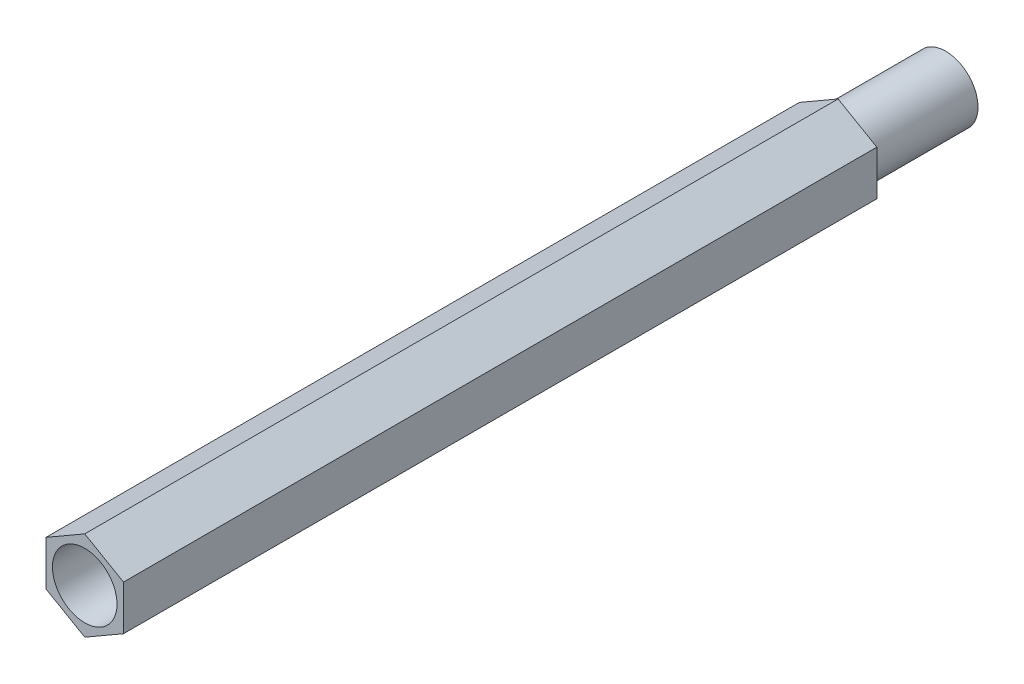
ISO-10303-21;
HEADER;
FILE_DESCRIPTION(('STEP AP214'),'2;1');
FILE_NAME('part.step','',(''),(''),'','','');
FILE_SCHEMA(('AUTOMOTIVE_DESIGN { 1 0 10303 214 1 1 1 1 }'));
ENDSEC;
DATA;
#1=APPLICATION_CONTEXT('core data for automotive mechanical design processes');
#2=APPLICATION_PROTOCOL_DEFINITION('international standard','automotive_design',2000,#1);
#3=PRODUCT_CONTEXT('',#1,'mechanical');
#4=PRODUCT('Part','Part','',(#3));
#5=PRODUCT_RELATED_PRODUCT_CATEGORY('part','',(#4));
#6=PRODUCT_DEFINITION_FORMATION('','',#4);
#7=PRODUCT_DEFINITION_CONTEXT('part definition',#1,'design');
#8=PRODUCT_DEFINITION('design','',#6,#7);
#9=PRODUCT_DEFINITION_SHAPE('','',#8);
#10=(LENGTH_UNIT() NAMED_UNIT(*) SI_UNIT(.MILLI.,.METRE.));
#11=(NAMED_UNIT(*) PLANE_ANGLE_UNIT() SI_UNIT($,.RADIAN.));
#12=(NAMED_UNIT(*) SI_UNIT($,.STERADIAN.) SOLID_ANGLE_UNIT());
#13=UNCERTAINTY_MEASURE_WITH_UNIT(LENGTH_MEASURE(1.E-05),#10,'distance_accuracy_value','');
#14=(GEOMETRIC_REPRESENTATION_CONTEXT(3) GLOBAL_UNCERTAINTY_ASSIGNED_CONTEXT((#13)) GLOBAL_UNIT_ASSIGNED_CONTEXT((#10,
#11,#12)) REPRESENTATION_CONTEXT('',''));
#15=CARTESIAN_POINT('',(0.,0.,0.));
#16=DIRECTION('',(0.,0.,1.));
#17=DIRECTION('',(1.,0.,0.));
#18=AXIS2_PLACEMENT_3D('',#15,#16,#17);
#19=CARTESIAN_POINT('',(0.,0.,35.));
#20=DIRECTION('',(0.,0.,-1.));
#21=DIRECTION('',(-1.,0.,0.));
#22=AXIS2_PLACEMENT_3D('',#19,#20,#21);
#23=CYLINDRICAL_SURFACE('',#22,1.5);
#24=CARTESIAN_POINT('',(0.,0.,35.));
#25=DIRECTION('',(0.,0.,1.));
#26=DIRECTION('',(1.,0.,0.));
#27=AXIS2_PLACEMENT_3D('',#24,#25,#26);
#28=CIRCLE('',#27,1.5);
#29=CARTESIAN_POINT('',(1.5,0.,35.));
#30=VERTEX_POINT('',#29);
#31=EDGE_CURVE('E141',#30,#30,#28,.T.);
#32=ORIENTED_EDGE('',*,*,#31,.T.);
#33=EDGE_LOOP('',(#32));
#34=FACE_BOUND('',#33,.T.);
#35=CARTESIAN_POINT('',(0.,0.,5.));
#36=DIRECTION('',(0.,0.,-1.));
#37=DIRECTION('',(-1.,0.,0.));
#38=AXIS2_PLACEMENT_3D('',#35,#36,#37);
#39=CIRCLE('',#38,1.5);
#40=CARTESIAN_POINT('',(-1.5,0.,5.));
#41=VERTEX_POINT('',#40);
#42=EDGE_CURVE('E258',#41,#41,#39,.T.);
#43=ORIENTED_EDGE('',*,*,#42,.T.);
#44=EDGE_LOOP('',(#43));
#45=FACE_BOUND('',#44,.T.);
#46=ADVANCED_FACE('F45',(#34,#45),#23,.F.);
#47=CARTESIAN_POINT('',(0.,0.,35.));
#48=DIRECTION('',(0.,0.,1.));
#49=DIRECTION('',(1.,0.,0.));
#50=AXIS2_PLACEMENT_3D('',#47,#48,#49);
#51=PLANE('',#50);
#52=DIRECTION('',(-0.866025403784439,0.5,0.));
#53=VECTOR('',#52,1.);
#54=CARTESIAN_POINT('',(1.8,1.03923048454133,35.));
#55=LINE('',#54,#53);
#56=CARTESIAN_POINT('',(1.8,1.03923048454133,35.));
#57=VERTEX_POINT('',#56);
#58=CARTESIAN_POINT('',(0.,2.07846096908265,35.));
#59=VERTEX_POINT('',#58);
#60=EDGE_CURVE('E153',#57,#59,#55,.T.);
#61=ORIENTED_EDGE('',*,*,#60,.T.);
#62=DIRECTION('',(-0.866025403784439,-0.5,0.));
#63=VECTOR('',#62,1.);
#64=CARTESIAN_POINT('',(0.,2.07846096908265,35.));
#65=LINE('',#64,#63);
#66=CARTESIAN_POINT('',(-1.8,1.03923048454133,35.));
#67=VERTEX_POINT('',#66);
#68=EDGE_CURVE('E100',#59,#67,#65,.T.);
#69=ORIENTED_EDGE('',*,*,#68,.T.);
#70=DIRECTION('',(0.,-1.,0.));
#71=VECTOR('',#70,1.);
#72=CARTESIAN_POINT('',(-1.8,1.03923048454133,35.));
#73=LINE('',#72,#71);
#74=CARTESIAN_POINT('',(-1.8,-1.03923048454133,35.));
#75=VERTEX_POINT('',#74);
#76=EDGE_CURVE('E114',#67,#75,#73,.T.);
#77=ORIENTED_EDGE('',*,*,#76,.T.);
#78=DIRECTION('',(0.866025403784439,-0.5,0.));
#79=VECTOR('',#78,1.);
#80=CARTESIAN_POINT('',(-1.8,-1.03923048454133,35.));
#81=LINE('',#80,#79);
#82=CARTESIAN_POINT('',(0.,-2.07846096908265,35.));
#83=VERTEX_POINT('',#82);
#84=EDGE_CURVE('E107',#75,#83,#81,.T.);
#85=ORIENTED_EDGE('',*,*,#84,.T.);
#86=DIRECTION('',(0.866025403784439,0.5,0.));
#87=VECTOR('',#86,1.);
#88=CARTESIAN_POINT('',(0.,-2.07846096908265,35.));
#89=LINE('',#88,#87);
#90=CARTESIAN_POINT('',(1.8,-1.03923048454133,35.));
#91=VERTEX_POINT('',#90);
#92=EDGE_CURVE('E112',#83,#91,#89,.T.);
#93=ORIENTED_EDGE('',*,*,#92,.T.);
#94=DIRECTION('',(0.,1.,0.));
#95=VECTOR('',#94,1.);
#96=CARTESIAN_POINT('',(1.8,-1.03923048454133,35.));
#97=LINE('',#96,#95);
#98=EDGE_CURVE('E63',#91,#57,#97,.T.);
#99=ORIENTED_EDGE('',*,*,#98,.T.);
#100=EDGE_LOOP('',(#61,#69,#77,#85,#93,#99));
#101=FACE_BOUND('',#100,.T.);
#102=ORIENTED_EDGE('',*,*,#31,.F.);
#103=EDGE_LOOP('',(#102));
#104=FACE_BOUND('',#103,.T.);
#105=ADVANCED_FACE('F109',(#101,#104),#51,.T.);
#106=CARTESIAN_POINT('',(0.,0.,0.));
#107=DIRECTION('',(0.,0.,1.));
#108=DIRECTION('',(1.,0.,0.));
#109=AXIS2_PLACEMENT_3D('',#106,#107,#108);
#110=PLANE('',#109);
#111=DIRECTION('',(-0.866025403784439,0.5,0.));
#112=VECTOR('',#111,1.);
#113=CARTESIAN_POINT('',(1.8,1.03923048454133,0.));
#114=LINE('',#113,#112);
#115=CARTESIAN_POINT('',(1.8,1.03923048454133,0.));
#116=VERTEX_POINT('',#115);
#117=CARTESIAN_POINT('',(0.,2.07846096908265,0.));
#118=VERTEX_POINT('',#117);
#119=EDGE_CURVE('E136',#116,#118,#114,.T.);
#120=ORIENTED_EDGE('',*,*,#119,.F.);
#121=DIRECTION('',(0.,1.,0.));
#122=VECTOR('',#121,1.);
#123=CARTESIAN_POINT('',(1.8,-1.03923048454133,0.));
#124=LINE('',#123,#122);
#125=CARTESIAN_POINT('',(1.8,-1.03923048454133,0.));
#126=VERTEX_POINT('',#125);
#127=EDGE_CURVE('E92',#126,#116,#124,.T.);
#128=ORIENTED_EDGE('',*,*,#127,.F.);
#129=DIRECTION('',(0.866025403784439,0.5,0.));
#130=VECTOR('',#129,1.);
#131=CARTESIAN_POINT('',(0.,-2.07846096908265,0.));
#132=LINE('',#131,#130);
#133=CARTESIAN_POINT('',(0.,-2.07846096908265,0.));
#134=VERTEX_POINT('',#133);
#135=EDGE_CURVE('E86',#134,#126,#132,.T.);
#136=ORIENTED_EDGE('',*,*,#135,.F.);
#137=DIRECTION('',(0.866025403784439,-0.5,0.));
#138=VECTOR('',#137,1.);
#139=CARTESIAN_POINT('',(-1.8,-1.03923048454133,0.));
#140=LINE('',#139,#138);
#141=CARTESIAN_POINT('',(-1.8,-1.03923048454133,0.));
#142=VERTEX_POINT('',#141);
#143=EDGE_CURVE('E123',#142,#134,#140,.T.);
#144=ORIENTED_EDGE('',*,*,#143,.F.);
#145=DIRECTION('',(0.,-1.,0.));
#146=VECTOR('',#145,1.);
#147=CARTESIAN_POINT('',(-1.8,1.03923048454133,0.));
#148=LINE('',#147,#146);
#149=CARTESIAN_POINT('',(-1.8,1.03923048454133,0.));
#150=VERTEX_POINT('',#149);
#151=EDGE_CURVE('E144',#150,#142,#148,.T.);
#152=ORIENTED_EDGE('',*,*,#151,.F.);
#153=DIRECTION('',(-0.866025403784439,-0.5,0.));
#154=VECTOR('',#153,1.);
#155=CARTESIAN_POINT('',(0.,2.07846096908265,0.));
#156=LINE('',#155,#154);
#157=EDGE_CURVE('E140',#118,#150,#156,.T.);
#158=ORIENTED_EDGE('',*,*,#157,.F.);
#159=EDGE_LOOP('',(#120,#128,#136,#144,#152,#158));
#160=FACE_BOUND('',#159,.T.);
#161=CARTESIAN_POINT('',(0.,0.,0.));
#162=DIRECTION('',(0.,0.,1.));
#163=DIRECTION('',(1.,0.,0.));
#164=AXIS2_PLACEMENT_3D('',#161,#162,#163);
#165=CIRCLE('',#164,1.5);
#166=CARTESIAN_POINT('',(1.5,0.,0.));
#167=VERTEX_POINT('',#166);
#168=EDGE_CURVE('E257',#167,#167,#165,.F.);
#169=ORIENTED_EDGE('',*,*,#168,.F.);
#170=EDGE_LOOP('',(#169));
#171=FACE_BOUND('',#170,.T.);
#172=ADVANCED_FACE('F166',(#160,#171),#110,.F.);
#173=CARTESIAN_POINT('',(1.8,1.03923048454133,35.));
#174=DIRECTION('',(-0.5,-0.866025403784439,0.));
#175=DIRECTION('',(0.866025403784439,-0.5,0.));
#176=AXIS2_PLACEMENT_3D('',#173,#174,#175);
#177=PLANE('',#176);
#178=ORIENTED_EDGE('',*,*,#119,.T.);
#179=DIRECTION('',(0.,0.,-1.));
#180=VECTOR('',#179,1.);
#181=CARTESIAN_POINT('',(0.,2.07846096908265,35.));
#182=LINE('',#181,#180);
#183=EDGE_CURVE('E11',#59,#118,#182,.T.);
#184=ORIENTED_EDGE('',*,*,#183,.F.);
#185=ORIENTED_EDGE('',*,*,#60,.F.);
#186=DIRECTION('',(0.,0.,-1.));
#187=VECTOR('',#186,1.);
#188=CARTESIAN_POINT('',(1.8,1.03923048454133,35.));
#189=LINE('',#188,#187);
#190=EDGE_CURVE('E132',#57,#116,#189,.T.);
#191=ORIENTED_EDGE('',*,*,#190,.T.);
#192=EDGE_LOOP('',(#178,#184,#185,#191));
#193=FACE_BOUND('',#192,.T.);
#194=ADVANCED_FACE('F47',(#193),#177,.F.);
#195=CARTESIAN_POINT('',(0.,2.07846096908265,35.));
#196=DIRECTION('',(0.5,-0.866025403784439,0.));
#197=DIRECTION('',(0.866025403784439,0.5,0.));
#198=AXIS2_PLACEMENT_3D('',#195,#196,#197);
#199=PLANE('',#198);
#200=ORIENTED_EDGE('',*,*,#157,.T.);
#201=DIRECTION('',(0.,0.,-1.));
#202=VECTOR('',#201,1.);
#203=CARTESIAN_POINT('',(-1.8,1.03923048454133,35.));
#204=LINE('',#203,#202);
#205=EDGE_CURVE('E55',#67,#150,#204,.T.);
#206=ORIENTED_EDGE('',*,*,#205,.F.);
#207=ORIENTED_EDGE('',*,*,#68,.F.);
#208=ORIENTED_EDGE('',*,*,#183,.T.);
#209=EDGE_LOOP('',(#200,#206,#207,#208));
#210=FACE_BOUND('',#209,.T.);
#211=ADVANCED_FACE('F198',(#210),#199,.F.);
#212=CARTESIAN_POINT('',(-1.8,1.03923048454133,35.));
#213=DIRECTION('',(1.,0.,0.));
#214=DIRECTION('',(0.,1.,0.));
#215=AXIS2_PLACEMENT_3D('',#212,#213,#214);
#216=PLANE('',#215);
#217=ORIENTED_EDGE('',*,*,#151,.T.);
#218=DIRECTION('',(0.,0.,-1.));
#219=VECTOR('',#218,1.);
#220=CARTESIAN_POINT('',(-1.8,-1.03923048454133,35.));
#221=LINE('',#220,#219);
#222=EDGE_CURVE('E125',#75,#142,#221,.T.);
#223=ORIENTED_EDGE('',*,*,#222,.F.);
#224=ORIENTED_EDGE('',*,*,#76,.F.);
#225=ORIENTED_EDGE('',*,*,#205,.T.);
#226=EDGE_LOOP('',(#217,#223,#224,#225));
#227=FACE_BOUND('',#226,.T.);
#228=ADVANCED_FACE('F163',(#227),#216,.F.);
#229=CARTESIAN_POINT('',(-1.8,-1.03923048454133,35.));
#230=DIRECTION('',(0.5,0.866025403784439,0.));
#231=DIRECTION('',(-0.866025403784439,0.5,0.));
#232=AXIS2_PLACEMENT_3D('',#229,#230,#231);
#233=PLANE('',#232);
#234=ORIENTED_EDGE('',*,*,#143,.T.);
#235=DIRECTION('',(0.,0.,-1.));
#236=VECTOR('',#235,1.);
#237=CARTESIAN_POINT('',(0.,-2.07846096908265,35.));
#238=LINE('',#237,#236);
#239=EDGE_CURVE('E120',#83,#134,#238,.T.);
#240=ORIENTED_EDGE('',*,*,#239,.F.);
#241=ORIENTED_EDGE('',*,*,#84,.F.);
#242=ORIENTED_EDGE('',*,*,#222,.T.);
#243=EDGE_LOOP('',(#234,#240,#241,#242));
#244=FACE_BOUND('',#243,.T.);
#245=ADVANCED_FACE('F121',(#244),#233,.F.);
#246=CARTESIAN_POINT('',(0.,-2.07846096908265,35.));
#247=DIRECTION('',(-0.5,0.866025403784439,0.));
#248=DIRECTION('',(-0.866025403784439,-0.5,0.));
#249=AXIS2_PLACEMENT_3D('',#246,#247,#248);
#250=PLANE('',#249);
#251=ORIENTED_EDGE('',*,*,#135,.T.);
#252=DIRECTION('',(0.,0.,-1.));
#253=VECTOR('',#252,1.);
#254=CARTESIAN_POINT('',(1.8,-1.03923048454133,35.));
#255=LINE('',#254,#253);
#256=EDGE_CURVE('E126',#91,#126,#255,.T.);
#257=ORIENTED_EDGE('',*,*,#256,.F.);
#258=ORIENTED_EDGE('',*,*,#92,.F.);
#259=ORIENTED_EDGE('',*,*,#239,.T.);
#260=EDGE_LOOP('',(#251,#257,#258,#259));
#261=FACE_BOUND('',#260,.T.);
#262=ADVANCED_FACE('F128',(#261),#250,.F.);
#263=CARTESIAN_POINT('',(1.8,-1.03923048454133,35.));
#264=DIRECTION('',(-1.,0.,0.));
#265=DIRECTION('',(0.,-1.,0.));
#266=AXIS2_PLACEMENT_3D('',#263,#264,#265);
#267=PLANE('',#266);
#268=ORIENTED_EDGE('',*,*,#127,.T.);
#269=ORIENTED_EDGE('',*,*,#190,.F.);
#270=ORIENTED_EDGE('',*,*,#98,.F.);
#271=ORIENTED_EDGE('',*,*,#256,.T.);
#272=EDGE_LOOP('',(#268,#269,#270,#271));
#273=FACE_BOUND('',#272,.T.);
#274=ADVANCED_FACE('F171',(#273),#267,.F.);
#275=CARTESIAN_POINT('',(0.,0.,5.));
#276=DIRECTION('',(0.,0.,-1.));
#277=DIRECTION('',(-1.,0.,0.));
#278=AXIS2_PLACEMENT_3D('',#275,#276,#277);
#279=PLANE('',#278);
#280=ORIENTED_EDGE('',*,*,#42,.F.);
#281=EDGE_LOOP('',(#280));
#282=FACE_BOUND('',#281,.T.);
#283=ADVANCED_FACE('F173',(#282),#279,.F.);
#284=CARTESIAN_POINT('',(0.,0.,-5.));
#285=DIRECTION('',(0.,0.,1.));
#286=DIRECTION('',(1.,0.,0.));
#287=AXIS2_PLACEMENT_3D('',#284,#285,#286);
#288=CYLINDRICAL_SURFACE('',#287,1.5);
#289=CARTESIAN_POINT('',(0.,0.,-5.));
#290=DIRECTION('',(0.,0.,-1.));
#291=DIRECTION('',(-1.,0.,0.));
#292=AXIS2_PLACEMENT_3D('',#289,#290,#291);
#293=CIRCLE('',#292,1.5);
#294=CARTESIAN_POINT('',(-1.5,0.,-5.));
#295=VERTEX_POINT('',#294);
#296=EDGE_CURVE('E255',#295,#295,#293,.T.);
#297=ORIENTED_EDGE('',*,*,#296,.F.);
#298=EDGE_LOOP('',(#297));
#299=FACE_BOUND('',#298,.T.);
#300=ORIENTED_EDGE('',*,*,#168,.T.);
#301=EDGE_LOOP('',(#300));
#302=FACE_BOUND('',#301,.T.);
#303=ADVANCED_FACE('F180',(#299,#302),#288,.T.);
#304=CARTESIAN_POINT('',(0.,0.,-5.));
#305=DIRECTION('',(0.,0.,-1.));
#306=DIRECTION('',(-1.,0.,0.));
#307=AXIS2_PLACEMENT_3D('',#304,#305,#306);
#308=PLANE('',#307);
#309=ORIENTED_EDGE('',*,*,#296,.T.);
#310=EDGE_LOOP('',(#309));
#311=FACE_BOUND('',#310,.T.);
#312=ADVANCED_FACE('F241',(#311),#308,.T.);
#313=CLOSED_SHELL('',(#46,#105,#172,#194,#211,#228,#245,#262,#274,#283,#303,#312));
#314=MANIFOLD_SOLID_BREP('B2',#313);
#315=ADVANCED_BREP_SHAPE_REPRESENTATION('',(#18,#314),#14);
#316=SHAPE_DEFINITION_REPRESENTATION(#9,#315);
ENDSEC;
END-ISO-10303-21;
